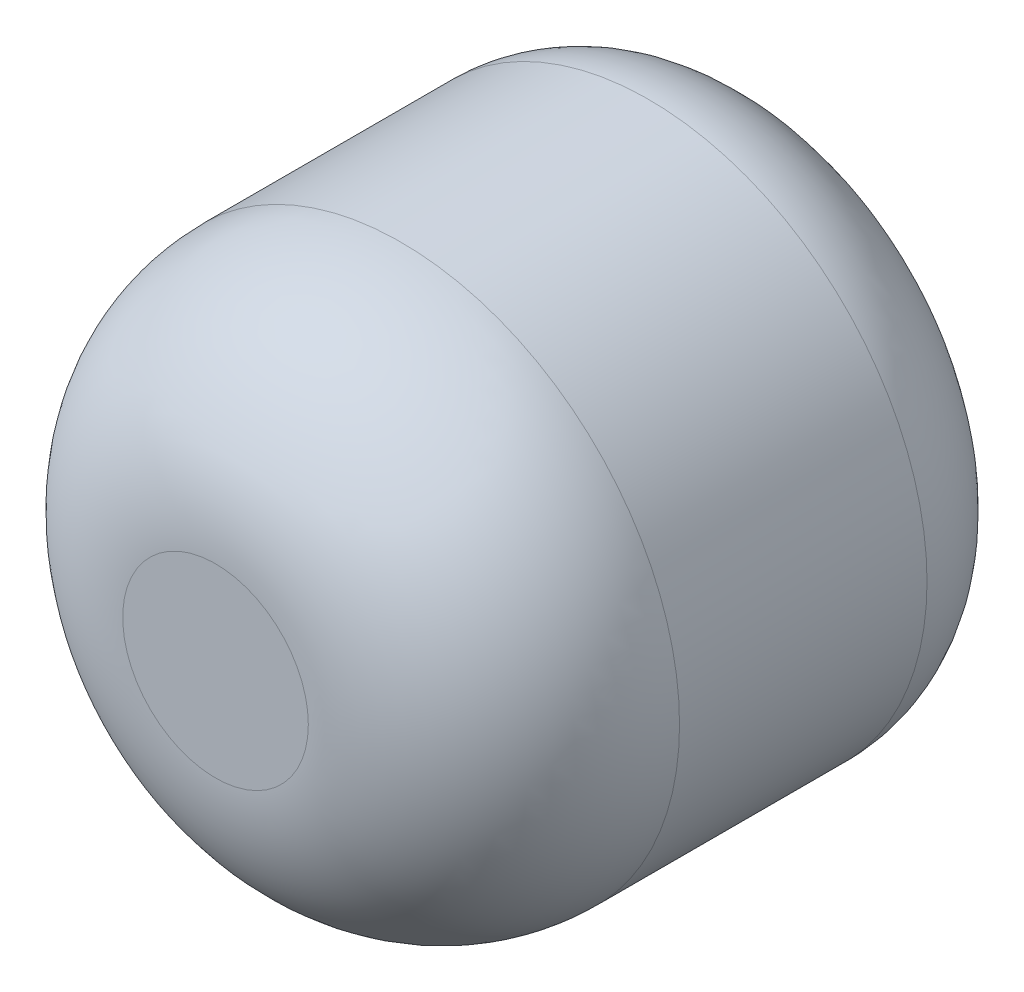
ISO-10303-21;
HEADER;
FILE_DESCRIPTION(('STEP AP214'),'2;1');
FILE_NAME('part.step','',(''),(''),'','','');
FILE_SCHEMA(('AUTOMOTIVE_DESIGN { 1 0 10303 214 1 1 1 1 }'));
ENDSEC;
DATA;
#1=APPLICATION_CONTEXT('core data for automotive mechanical design processes');
#2=APPLICATION_PROTOCOL_DEFINITION('international standard','automotive_design',2000,#1);
#3=PRODUCT_CONTEXT('',#1,'mechanical');
#4=PRODUCT('Part','Part','',(#3));
#5=PRODUCT_RELATED_PRODUCT_CATEGORY('part','',(#4));
#6=PRODUCT_DEFINITION_FORMATION('','',#4);
#7=PRODUCT_DEFINITION_CONTEXT('part definition',#1,'design');
#8=PRODUCT_DEFINITION('design','',#6,#7);
#9=PRODUCT_DEFINITION_SHAPE('','',#8);
#10=(LENGTH_UNIT() NAMED_UNIT(*) SI_UNIT(.MILLI.,.METRE.));
#11=(NAMED_UNIT(*) PLANE_ANGLE_UNIT() SI_UNIT($,.RADIAN.));
#12=(NAMED_UNIT(*) SI_UNIT($,.STERADIAN.) SOLID_ANGLE_UNIT());
#13=UNCERTAINTY_MEASURE_WITH_UNIT(LENGTH_MEASURE(1.E-05),#10,'distance_accuracy_value','');
#14=(GEOMETRIC_REPRESENTATION_CONTEXT(3) GLOBAL_UNCERTAINTY_ASSIGNED_CONTEXT((#13)) GLOBAL_UNIT_ASSIGNED_CONTEXT((#10,
#11,#12)) REPRESENTATION_CONTEXT('',''));
#15=CARTESIAN_POINT('',(0.,0.,0.));
#16=DIRECTION('',(0.,0.,1.));
#17=DIRECTION('',(1.,0.,0.));
#18=AXIS2_PLACEMENT_3D('',#15,#16,#17);
#19=CARTESIAN_POINT('',(0.,0.,9.));
#20=DIRECTION('',(0.,0.,-1.));
#21=DIRECTION('',(-1.,0.,0.));
#22=AXIS2_PLACEMENT_3D('',#19,#20,#21);
#23=CYLINDRICAL_SURFACE('',#22,4.5);
#24=CARTESIAN_POINT('',(0.,0.,2.));
#25=DIRECTION('',(0.,0.,1.));
#26=DIRECTION('',(1.,0.,0.));
#27=AXIS2_PLACEMENT_3D('',#24,#25,#26);
#28=CIRCLE('',#27,4.5);
#29=CARTESIAN_POINT('',(4.5,0.,2.));
#30=VERTEX_POINT('',#29);
#31=EDGE_CURVE('E51',#30,#30,#28,.T.);
#32=ORIENTED_EDGE('',*,*,#31,.T.);
#33=EDGE_LOOP('',(#32));
#34=FACE_BOUND('',#33,.T.);
#35=CARTESIAN_POINT('',(0.,0.,6.));
#36=DIRECTION('',(0.,0.,1.));
#37=DIRECTION('',(1.,0.,0.));
#38=AXIS2_PLACEMENT_3D('',#35,#36,#37);
#39=CIRCLE('',#38,4.5);
#40=CARTESIAN_POINT('',(4.5,0.,6.));
#41=VERTEX_POINT('',#40);
#42=EDGE_CURVE('E55',#41,#41,#39,.F.);
#43=ORIENTED_EDGE('',*,*,#42,.T.);
#44=EDGE_LOOP('',(#43));
#45=FACE_BOUND('',#44,.T.);
#46=ADVANCED_FACE('F39',(#34,#45),#23,.T.);
#47=CARTESIAN_POINT('',(0.,0.,9.));
#48=DIRECTION('',(0.,0.,1.));
#49=DIRECTION('',(1.,0.,0.));
#50=AXIS2_PLACEMENT_3D('',#47,#48,#49);
#51=PLANE('',#50);
#52=CARTESIAN_POINT('',(0.,0.,9.));
#53=DIRECTION('',(0.,0.,1.));
#54=DIRECTION('',(1.,0.,0.));
#55=AXIS2_PLACEMENT_3D('',#52,#53,#54);
#56=CIRCLE('',#55,1.5);
#57=CARTESIAN_POINT('',(1.5,0.,9.));
#58=VERTEX_POINT('',#57);
#59=EDGE_CURVE('E60',#58,#58,#56,.T.);
#60=ORIENTED_EDGE('',*,*,#59,.T.);
#61=EDGE_LOOP('',(#60));
#62=FACE_BOUND('',#61,.T.);
#63=ADVANCED_FACE('F80',(#62),#51,.T.);
#64=CARTESIAN_POINT('',(0.,0.,6.));
#65=DIRECTION('',(0.,0.,1.));
#66=DIRECTION('',(1.,0.,0.));
#67=AXIS2_PLACEMENT_3D('',#64,#65,#66);
#68=DEGENERATE_TOROIDAL_SURFACE('',#67,1.5,3.,.T.);
#69=ORIENTED_EDGE('',*,*,#42,.F.);
#70=EDGE_LOOP('',(#69));
#71=FACE_BOUND('',#70,.T.);
#72=ORIENTED_EDGE('',*,*,#59,.F.);
#73=EDGE_LOOP('',(#72));
#74=FACE_BOUND('',#73,.T.);
#75=ADVANCED_FACE('F86',(#71,#74),#68,.T.);
#76=CARTESIAN_POINT('',(0.,0.,2.));
#77=DIRECTION('',(0.,0.,1.));
#78=DIRECTION('',(1.,0.,0.));
#79=AXIS2_PLACEMENT_3D('',#76,#77,#78);
#80=TOROIDAL_SURFACE('',#79,2.5,2.);
#81=CARTESIAN_POINT('',(0.,0.,0.0724223606932072));
#82=DIRECTION('',(0.,0.,1.));
#83=DIRECTION('',(1.,0.,0.));
#84=AXIS2_PLACEMENT_3D('',#81,#82,#83);
#85=CIRCLE('',#84,3.03333333333335);
#86=CARTESIAN_POINT('',(3.03333333333335,0.,0.0724223606932072));
#87=VERTEX_POINT('',#86);
#88=EDGE_CURVE('E47',#87,#87,#85,.T.);
#89=ORIENTED_EDGE('',*,*,#88,.T.);
#90=EDGE_LOOP('',(#89));
#91=FACE_BOUND('',#90,.T.);
#92=ORIENTED_EDGE('',*,*,#31,.F.);
#93=EDGE_LOOP('',(#92));
#94=FACE_BOUND('',#93,.T.);
#95=ADVANCED_FACE('F77',(#91,#94),#80,.T.);
#96=CARTESIAN_POINT('',(0.,0.,-6.));
#97=DIRECTION('',(0.,0.,1.));
#98=DIRECTION('',(1.,0.,0.));
#99=AXIS2_PLACEMENT_3D('',#96,#97,#98);
#100=CYLINDRICAL_SURFACE('',#99,2.4);
#101=CARTESIAN_POINT('',(0.,0.,0.55431677051991));
#102=DIRECTION('',(0.,0.,-1.));
#103=DIRECTION('',(-1.,0.,0.));
#104=AXIS2_PLACEMENT_3D('',#101,#102,#103);
#105=CIRCLE('',#104,2.4);
#106=CARTESIAN_POINT('',(-2.4,0.,0.55431677051991));
#107=VERTEX_POINT('',#106);
#108=EDGE_CURVE('E10',#107,#107,#105,.T.);
#109=ORIENTED_EDGE('',*,*,#108,.T.);
#110=EDGE_LOOP('',(#109));
#111=FACE_BOUND('',#110,.T.);
#112=CARTESIAN_POINT('',(0.,0.,6.));
#113=DIRECTION('',(0.,0.,1.));
#114=DIRECTION('',(1.,0.,0.));
#115=AXIS2_PLACEMENT_3D('',#112,#113,#114);
#116=CIRCLE('',#115,2.4);
#117=CARTESIAN_POINT('',(2.4,0.,6.));
#118=VERTEX_POINT('',#117);
#119=EDGE_CURVE('E63',#118,#118,#116,.T.);
#120=ORIENTED_EDGE('',*,*,#119,.T.);
#121=EDGE_LOOP('',(#120));
#122=FACE_BOUND('',#121,.T.);
#123=ADVANCED_FACE('F67',(#111,#122),#100,.F.);
#124=CARTESIAN_POINT('',(0.,0.,6.));
#125=DIRECTION('',(0.,0.,1.));
#126=DIRECTION('',(1.,0.,0.));
#127=AXIS2_PLACEMENT_3D('',#124,#125,#126);
#128=PLANE('',#127);
#129=ORIENTED_EDGE('',*,*,#119,.F.);
#130=EDGE_LOOP('',(#129));
#131=FACE_BOUND('',#130,.T.);
#132=ADVANCED_FACE('F69',(#131),#128,.F.);
#133=CARTESIAN_POINT('',(0.,0.,0.0724223606932087));
#134=DIRECTION('',(0.,0.,-1.));
#135=DIRECTION('',(-1.,0.,0.));
#136=AXIS2_PLACEMENT_3D('',#133,#134,#135);
#137=CONICAL_SURFACE('',#136,3.03333333333335,0.920364561314157);
#138=ORIENTED_EDGE('',*,*,#108,.F.);
#139=EDGE_LOOP('',(#138));
#140=FACE_BOUND('',#139,.T.);
#141=ORIENTED_EDGE('',*,*,#88,.F.);
#142=EDGE_LOOP('',(#141));
#143=FACE_BOUND('',#142,.T.);
#144=ADVANCED_FACE('F42',(#140,#143),#137,.F.);
#145=CLOSED_SHELL('',(#46,#63,#75,#95,#123,#132,#144));
#146=MANIFOLD_SOLID_BREP('B2',#145);
#147=ADVANCED_BREP_SHAPE_REPRESENTATION('',(#18,#146),#14);
#148=SHAPE_DEFINITION_REPRESENTATION(#9,#147);
ENDSEC;
END-ISO-10303-21;
